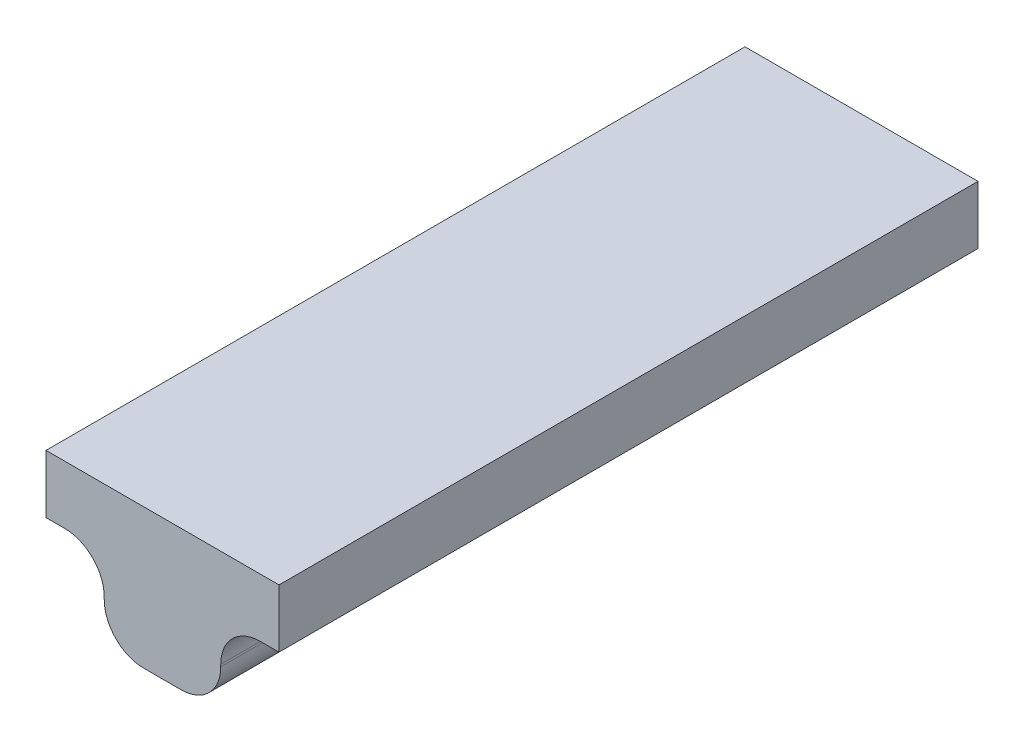
ISO-10303-21;
HEADER;
FILE_DESCRIPTION(('STEP AP214'),'2;1');
FILE_NAME('part.step','',(''),(''),'','','');
FILE_SCHEMA(('AUTOMOTIVE_DESIGN { 1 0 10303 214 1 1 1 1 }'));
ENDSEC;
DATA;
#1=APPLICATION_CONTEXT('core data for automotive mechanical design processes');
#2=APPLICATION_PROTOCOL_DEFINITION('international standard','automotive_design',2000,#1);
#3=PRODUCT_CONTEXT('',#1,'mechanical');
#4=PRODUCT('Part','Part','',(#3));
#5=PRODUCT_RELATED_PRODUCT_CATEGORY('part','',(#4));
#6=PRODUCT_DEFINITION_FORMATION('','',#4);
#7=PRODUCT_DEFINITION_CONTEXT('part definition',#1,'design');
#8=PRODUCT_DEFINITION('design','',#6,#7);
#9=PRODUCT_DEFINITION_SHAPE('','',#8);
#10=(LENGTH_UNIT() NAMED_UNIT(*) SI_UNIT(.MILLI.,.METRE.));
#11=(NAMED_UNIT(*) PLANE_ANGLE_UNIT() SI_UNIT($,.RADIAN.));
#12=(NAMED_UNIT(*) SI_UNIT($,.STERADIAN.) SOLID_ANGLE_UNIT());
#13=UNCERTAINTY_MEASURE_WITH_UNIT(LENGTH_MEASURE(1.E-05),#10,'distance_accuracy_value','');
#14=(GEOMETRIC_REPRESENTATION_CONTEXT(3) GLOBAL_UNCERTAINTY_ASSIGNED_CONTEXT((#13)) GLOBAL_UNIT_ASSIGNED_CONTEXT((#10,
#11,#12)) REPRESENTATION_CONTEXT('',''));
#15=CARTESIAN_POINT('',(0.,0.,0.));
#16=DIRECTION('',(0.,0.,1.));
#17=DIRECTION('',(1.,0.,0.));
#18=AXIS2_PLACEMENT_3D('',#15,#16,#17);
#19=CARTESIAN_POINT('',(-1.,0.,6.));
#20=DIRECTION('',(1.,0.,0.));
#21=DIRECTION('',(0.,0.,-1.));
#22=AXIS2_PLACEMENT_3D('',#19,#20,#21);
#23=PLANE('',#22);
#24=DIRECTION('',(0.,-1.,0.));
#25=VECTOR('',#24,1.);
#26=CARTESIAN_POINT('',(-1.,0.,0.));
#27=LINE('',#26,#25);
#28=CARTESIAN_POINT('',(-1.,0.,0.));
#29=VERTEX_POINT('',#28);
#30=CARTESIAN_POINT('',(-1.,-0.500000000000001,0.));
#31=VERTEX_POINT('',#30);
#32=EDGE_CURVE('E158',#29,#31,#27,.T.);
#33=ORIENTED_EDGE('',*,*,#32,.T.);
#34=DIRECTION('',(0.,0.,-1.));
#35=VECTOR('',#34,1.);
#36=CARTESIAN_POINT('',(-1.,-0.500000000000001,6.));
#37=LINE('',#36,#35);
#38=CARTESIAN_POINT('',(-1.,-0.500000000000001,6.));
#39=VERTEX_POINT('',#38);
#40=EDGE_CURVE('E11',#39,#31,#37,.T.);
#41=ORIENTED_EDGE('',*,*,#40,.F.);
#42=DIRECTION('',(0.,-1.,0.));
#43=VECTOR('',#42,1.);
#44=CARTESIAN_POINT('',(-1.,0.,6.));
#45=LINE('',#44,#43);
#46=CARTESIAN_POINT('',(-1.,0.,6.));
#47=VERTEX_POINT('',#46);
#48=EDGE_CURVE('E180',#47,#39,#45,.T.);
#49=ORIENTED_EDGE('',*,*,#48,.F.);
#50=DIRECTION('',(0.,0.,-1.));
#51=VECTOR('',#50,1.);
#52=CARTESIAN_POINT('',(-1.,0.,6.));
#53=LINE('',#52,#51);
#54=EDGE_CURVE('E154',#47,#29,#53,.T.);
#55=ORIENTED_EDGE('',*,*,#54,.T.);
#56=EDGE_LOOP('',(#33,#41,#49,#55));
#57=FACE_BOUND('',#56,.T.);
#58=ADVANCED_FACE('F38',(#57),#23,.F.);
#59=CARTESIAN_POINT('',(-1.,-0.500000000000001,6.));
#60=DIRECTION('',(0.,1.,0.));
#61=DIRECTION('',(0.,0.,1.));
#62=AXIS2_PLACEMENT_3D('',#59,#60,#61);
#63=PLANE('',#62);
#64=DIRECTION('',(1.,0.,0.));
#65=VECTOR('',#64,1.);
#66=CARTESIAN_POINT('',(-1.,-0.500000000000001,0.));
#67=LINE('',#66,#65);
#68=CARTESIAN_POINT('',(-0.840000000000001,-0.500000000000001,0.));
#69=VERTEX_POINT('',#68);
#70=EDGE_CURVE('E161',#31,#69,#67,.T.);
#71=ORIENTED_EDGE('',*,*,#70,.T.);
#72=DIRECTION('',(0.,0.,-1.));
#73=VECTOR('',#72,1.);
#74=CARTESIAN_POINT('',(-0.840000000000001,-0.500000000000001,6.));
#75=LINE('',#74,#73);
#76=CARTESIAN_POINT('',(-0.840000000000001,-0.500000000000001,6.));
#77=VERTEX_POINT('',#76);
#78=EDGE_CURVE('E46',#77,#69,#75,.T.);
#79=ORIENTED_EDGE('',*,*,#78,.F.);
#80=DIRECTION('',(1.,0.,0.));
#81=VECTOR('',#80,1.);
#82=CARTESIAN_POINT('',(-1.,-0.500000000000001,6.));
#83=LINE('',#82,#81);
#84=EDGE_CURVE('E109',#39,#77,#83,.T.);
#85=ORIENTED_EDGE('',*,*,#84,.F.);
#86=ORIENTED_EDGE('',*,*,#40,.T.);
#87=EDGE_LOOP('',(#71,#79,#85,#86));
#88=FACE_BOUND('',#87,.T.);
#89=ADVANCED_FACE('F258',(#88),#63,.F.);
#90=CARTESIAN_POINT('',(-0.840000000000001,-0.840000000000001,6.));
#91=DIRECTION('',(0.,0.,-1.));
#92=DIRECTION('',(-1.,0.,0.));
#93=AXIS2_PLACEMENT_3D('',#90,#91,#92);
#94=CYLINDRICAL_SURFACE('',#93,0.34);
#95=CARTESIAN_POINT('',(-0.840000000000001,-0.840000000000001,0.));
#96=DIRECTION('',(0.,0.,-1.));
#97=DIRECTION('',(-1.,0.,0.));
#98=AXIS2_PLACEMENT_3D('',#95,#96,#97);
#99=CIRCLE('',#98,0.34);
#100=CARTESIAN_POINT('',(-0.500000000000001,-0.840000000000001,0.));
#101=VERTEX_POINT('',#100);
#102=EDGE_CURVE('E163',#69,#101,#99,.T.);
#103=ORIENTED_EDGE('',*,*,#102,.T.);
#104=DIRECTION('',(0.,0.,-1.));
#105=VECTOR('',#104,1.);
#106=CARTESIAN_POINT('',(-0.500000000000001,-0.840000000000001,6.));
#107=LINE('',#106,#105);
#108=CARTESIAN_POINT('',(-0.500000000000001,-0.840000000000001,6.));
#109=VERTEX_POINT('',#108);
#110=EDGE_CURVE('E199',#109,#101,#107,.T.);
#111=ORIENTED_EDGE('',*,*,#110,.F.);
#112=CARTESIAN_POINT('',(-0.840000000000001,-0.840000000000001,6.));
#113=DIRECTION('',(0.,0.,-1.));
#114=DIRECTION('',(-1.,0.,0.));
#115=AXIS2_PLACEMENT_3D('',#112,#113,#114);
#116=CIRCLE('',#115,0.34);
#117=EDGE_CURVE('E207',#77,#109,#116,.T.);
#118=ORIENTED_EDGE('',*,*,#117,.F.);
#119=ORIENTED_EDGE('',*,*,#78,.T.);
#120=EDGE_LOOP('',(#103,#111,#118,#119));
#121=FACE_BOUND('',#120,.T.);
#122=ADVANCED_FACE('F205',(#121),#94,.F.);
#123=CARTESIAN_POINT('',(-0.500000000000001,-0.840000000000001,6.));
#124=DIRECTION('',(1.,0.,0.));
#125=DIRECTION('',(0.,0.,-1.));
#126=AXIS2_PLACEMENT_3D('',#123,#124,#125);
#127=PLANE('',#126);
#128=DIRECTION('',(0.,-1.,0.));
#129=VECTOR('',#128,1.);
#130=CARTESIAN_POINT('',(-0.500000000000001,-0.840000000000001,0.));
#131=LINE('',#130,#129);
#132=CARTESIAN_POINT('',(-0.500000000000001,-0.860000000000001,0.));
#133=VERTEX_POINT('',#132);
#134=EDGE_CURVE('E165',#101,#133,#131,.T.);
#135=ORIENTED_EDGE('',*,*,#134,.T.);
#136=DIRECTION('',(0.,0.,-1.));
#137=VECTOR('',#136,1.);
#138=CARTESIAN_POINT('',(-0.500000000000001,-0.860000000000001,6.));
#139=LINE('',#138,#137);
#140=CARTESIAN_POINT('',(-0.500000000000001,-0.860000000000001,6.));
#141=VERTEX_POINT('',#140);
#142=EDGE_CURVE('E196',#141,#133,#139,.T.);
#143=ORIENTED_EDGE('',*,*,#142,.F.);
#144=DIRECTION('',(0.,-1.,0.));
#145=VECTOR('',#144,1.);
#146=CARTESIAN_POINT('',(-0.500000000000001,-0.840000000000001,6.));
#147=LINE('',#146,#145);
#148=EDGE_CURVE('E225',#109,#141,#147,.T.);
#149=ORIENTED_EDGE('',*,*,#148,.F.);
#150=ORIENTED_EDGE('',*,*,#110,.T.);
#151=EDGE_LOOP('',(#135,#143,#149,#150));
#152=FACE_BOUND('',#151,.T.);
#153=ADVANCED_FACE('F216',(#152),#127,.F.);
#154=CARTESIAN_POINT('',(-0.160000000000001,-0.860000000000001,6.));
#155=DIRECTION('',(0.,0.,-1.));
#156=DIRECTION('',(-1.,0.,0.));
#157=AXIS2_PLACEMENT_3D('',#154,#155,#156);
#158=CYLINDRICAL_SURFACE('',#157,0.34);
#159=CARTESIAN_POINT('',(-0.160000000000001,-0.860000000000001,0.));
#160=DIRECTION('',(0.,0.,1.));
#161=DIRECTION('',(1.,0.,0.));
#162=AXIS2_PLACEMENT_3D('',#159,#160,#161);
#163=CIRCLE('',#162,0.34);
#164=CARTESIAN_POINT('',(-0.16,-1.2,0.));
#165=VERTEX_POINT('',#164);
#166=EDGE_CURVE('E167',#133,#165,#163,.T.);
#167=ORIENTED_EDGE('',*,*,#166,.T.);
#168=DIRECTION('',(0.,0.,-1.));
#169=VECTOR('',#168,1.);
#170=CARTESIAN_POINT('',(-0.16,-1.2,6.));
#171=LINE('',#170,#169);
#172=CARTESIAN_POINT('',(-0.16,-1.2,6.));
#173=VERTEX_POINT('',#172);
#174=EDGE_CURVE('E193',#173,#165,#171,.T.);
#175=ORIENTED_EDGE('',*,*,#174,.F.);
#176=CARTESIAN_POINT('',(-0.160000000000001,-0.860000000000001,6.));
#177=DIRECTION('',(0.,0.,1.));
#178=DIRECTION('',(1.,0.,0.));
#179=AXIS2_PLACEMENT_3D('',#176,#177,#178);
#180=CIRCLE('',#179,0.34);
#181=EDGE_CURVE('E222',#141,#173,#180,.T.);
#182=ORIENTED_EDGE('',*,*,#181,.F.);
#183=ORIENTED_EDGE('',*,*,#142,.T.);
#184=EDGE_LOOP('',(#167,#175,#182,#183));
#185=FACE_BOUND('',#184,.T.);
#186=ADVANCED_FACE('F220',(#185),#158,.T.);
#187=CARTESIAN_POINT('',(-0.16,-1.2,6.));
#188=DIRECTION('',(0.,1.,0.));
#189=DIRECTION('',(-1.,0.,0.));
#190=AXIS2_PLACEMENT_3D('',#187,#188,#189);
#191=PLANE('',#190);
#192=DIRECTION('',(1.,0.,0.));
#193=VECTOR('',#192,1.);
#194=CARTESIAN_POINT('',(-0.16,-1.2,0.));
#195=LINE('',#194,#193);
#196=CARTESIAN_POINT('',(0.159999999999999,-1.2,0.));
#197=VERTEX_POINT('',#196);
#198=EDGE_CURVE('E169',#165,#197,#195,.T.);
#199=ORIENTED_EDGE('',*,*,#198,.T.);
#200=DIRECTION('',(0.,0.,-1.));
#201=VECTOR('',#200,1.);
#202=CARTESIAN_POINT('',(0.159999999999999,-1.2,6.));
#203=LINE('',#202,#201);
#204=CARTESIAN_POINT('',(0.159999999999999,-1.2,6.));
#205=VERTEX_POINT('',#204);
#206=EDGE_CURVE('E190',#205,#197,#203,.T.);
#207=ORIENTED_EDGE('',*,*,#206,.F.);
#208=DIRECTION('',(1.,0.,0.));
#209=VECTOR('',#208,1.);
#210=CARTESIAN_POINT('',(-0.16,-1.2,6.));
#211=LINE('',#210,#209);
#212=EDGE_CURVE('E224',#173,#205,#211,.T.);
#213=ORIENTED_EDGE('',*,*,#212,.F.);
#214=ORIENTED_EDGE('',*,*,#174,.T.);
#215=EDGE_LOOP('',(#199,#207,#213,#214));
#216=FACE_BOUND('',#215,.T.);
#217=ADVANCED_FACE('F271',(#216),#191,.F.);
#218=CARTESIAN_POINT('',(0.159999999999999,-0.86,6.));
#219=DIRECTION('',(0.,0.,-1.));
#220=DIRECTION('',(-1.,0.,0.));
#221=AXIS2_PLACEMENT_3D('',#218,#219,#220);
#222=CYLINDRICAL_SURFACE('',#221,0.34);
#223=CARTESIAN_POINT('',(0.159999999999999,-0.86,0.));
#224=DIRECTION('',(0.,0.,1.));
#225=DIRECTION('',(1.,0.,0.));
#226=AXIS2_PLACEMENT_3D('',#223,#224,#225);
#227=CIRCLE('',#226,0.34);
#228=CARTESIAN_POINT('',(0.499999999999999,-0.86,0.));
#229=VERTEX_POINT('',#228);
#230=EDGE_CURVE('E171',#197,#229,#227,.T.);
#231=ORIENTED_EDGE('',*,*,#230,.T.);
#232=DIRECTION('',(0.,0.,-1.));
#233=VECTOR('',#232,1.);
#234=CARTESIAN_POINT('',(0.499999999999999,-0.86,6.));
#235=LINE('',#234,#233);
#236=CARTESIAN_POINT('',(0.499999999999999,-0.86,6.));
#237=VERTEX_POINT('',#236);
#238=EDGE_CURVE('E187',#237,#229,#235,.T.);
#239=ORIENTED_EDGE('',*,*,#238,.F.);
#240=CARTESIAN_POINT('',(0.159999999999999,-0.86,6.));
#241=DIRECTION('',(0.,0.,1.));
#242=DIRECTION('',(1.,0.,0.));
#243=AXIS2_PLACEMENT_3D('',#240,#241,#242);
#244=CIRCLE('',#243,0.34);
#245=EDGE_CURVE('E227',#205,#237,#244,.T.);
#246=ORIENTED_EDGE('',*,*,#245,.F.);
#247=ORIENTED_EDGE('',*,*,#206,.T.);
#248=EDGE_LOOP('',(#231,#239,#246,#247));
#249=FACE_BOUND('',#248,.T.);
#250=ADVANCED_FACE('F274',(#249),#222,.T.);
#251=CARTESIAN_POINT('',(0.499999999999999,-0.840000000000001,6.));
#252=DIRECTION('',(-1.,0.,0.));
#253=DIRECTION('',(0.,0.,1.));
#254=AXIS2_PLACEMENT_3D('',#251,#252,#253);
#255=PLANE('',#254);
#256=DIRECTION('',(0.,1.,0.));
#257=VECTOR('',#256,1.);
#258=CARTESIAN_POINT('',(0.499999999999999,-0.840000000000001,0.));
#259=LINE('',#258,#257);
#260=CARTESIAN_POINT('',(0.499999999999999,-0.840000000000001,0.));
#261=VERTEX_POINT('',#260);
#262=EDGE_CURVE('E173',#229,#261,#259,.T.);
#263=ORIENTED_EDGE('',*,*,#262,.T.);
#264=DIRECTION('',(0.,0.,-1.));
#265=VECTOR('',#264,1.);
#266=CARTESIAN_POINT('',(0.499999999999999,-0.840000000000001,6.));
#267=LINE('',#266,#265);
#268=CARTESIAN_POINT('',(0.499999999999999,-0.840000000000001,6.));
#269=VERTEX_POINT('',#268);
#270=EDGE_CURVE('E184',#269,#261,#267,.T.);
#271=ORIENTED_EDGE('',*,*,#270,.F.);
#272=DIRECTION('',(0.,1.,0.));
#273=VECTOR('',#272,1.);
#274=CARTESIAN_POINT('',(0.499999999999999,-0.840000000000001,6.));
#275=LINE('',#274,#273);
#276=EDGE_CURVE('E233',#237,#269,#275,.T.);
#277=ORIENTED_EDGE('',*,*,#276,.F.);
#278=ORIENTED_EDGE('',*,*,#238,.T.);
#279=EDGE_LOOP('',(#263,#271,#277,#278));
#280=FACE_BOUND('',#279,.T.);
#281=ADVANCED_FACE('F239',(#280),#255,.F.);
#282=CARTESIAN_POINT('',(0.84,-0.840000000000001,6.));
#283=DIRECTION('',(0.,0.,-1.));
#284=DIRECTION('',(-1.,0.,0.));
#285=AXIS2_PLACEMENT_3D('',#282,#283,#284);
#286=CYLINDRICAL_SURFACE('',#285,0.34);
#287=CARTESIAN_POINT('',(0.84,-0.840000000000001,0.));
#288=DIRECTION('',(0.,0.,-1.));
#289=DIRECTION('',(1.,0.,0.));
#290=AXIS2_PLACEMENT_3D('',#287,#288,#289);
#291=CIRCLE('',#290,0.34);
#292=CARTESIAN_POINT('',(0.839999999999999,-0.500000000000001,0.));
#293=VERTEX_POINT('',#292);
#294=EDGE_CURVE('E175',#261,#293,#291,.T.);
#295=ORIENTED_EDGE('',*,*,#294,.T.);
#296=DIRECTION('',(0.,0.,-1.));
#297=VECTOR('',#296,1.);
#298=CARTESIAN_POINT('',(0.839999999999999,-0.500000000000001,6.));
#299=LINE('',#298,#297);
#300=CARTESIAN_POINT('',(0.839999999999999,-0.500000000000001,6.));
#301=VERTEX_POINT('',#300);
#302=EDGE_CURVE('E149',#301,#293,#299,.T.);
#303=ORIENTED_EDGE('',*,*,#302,.F.);
#304=CARTESIAN_POINT('',(0.84,-0.840000000000001,6.));
#305=DIRECTION('',(0.,0.,-1.));
#306=DIRECTION('',(1.,0.,0.));
#307=AXIS2_PLACEMENT_3D('',#304,#305,#306);
#308=CIRCLE('',#307,0.34);
#309=EDGE_CURVE('E140',#269,#301,#308,.T.);
#310=ORIENTED_EDGE('',*,*,#309,.F.);
#311=ORIENTED_EDGE('',*,*,#270,.T.);
#312=EDGE_LOOP('',(#295,#303,#310,#311));
#313=FACE_BOUND('',#312,.T.);
#314=ADVANCED_FACE('F243',(#313),#286,.F.);
#315=CARTESIAN_POINT('',(0.839999999999999,-0.500000000000001,6.));
#316=DIRECTION('',(0.,1.,0.));
#317=DIRECTION('',(-1.,0.,0.));
#318=AXIS2_PLACEMENT_3D('',#315,#316,#317);
#319=PLANE('',#318);
#320=DIRECTION('',(1.,0.,0.));
#321=VECTOR('',#320,1.);
#322=CARTESIAN_POINT('',(0.839999999999999,-0.500000000000001,0.));
#323=LINE('',#322,#321);
#324=CARTESIAN_POINT('',(0.999999999999999,-0.5,0.));
#325=VERTEX_POINT('',#324);
#326=EDGE_CURVE('E148',#293,#325,#323,.T.);
#327=ORIENTED_EDGE('',*,*,#326,.T.);
#328=DIRECTION('',(0.,0.,-1.));
#329=VECTOR('',#328,1.);
#330=CARTESIAN_POINT('',(0.999999999999999,-0.5,6.));
#331=LINE('',#330,#329);
#332=CARTESIAN_POINT('',(0.999999999999999,-0.5,6.));
#333=VERTEX_POINT('',#332);
#334=EDGE_CURVE('E145',#333,#325,#331,.T.);
#335=ORIENTED_EDGE('',*,*,#334,.F.);
#336=DIRECTION('',(1.,0.,0.));
#337=VECTOR('',#336,1.);
#338=CARTESIAN_POINT('',(0.839999999999999,-0.500000000000001,6.));
#339=LINE('',#338,#337);
#340=EDGE_CURVE('E134',#301,#333,#339,.T.);
#341=ORIENTED_EDGE('',*,*,#340,.F.);
#342=ORIENTED_EDGE('',*,*,#302,.T.);
#343=EDGE_LOOP('',(#327,#335,#341,#342));
#344=FACE_BOUND('',#343,.T.);
#345=ADVANCED_FACE('F146',(#344),#319,.F.);
#346=CARTESIAN_POINT('',(0.999999999999999,0.,6.));
#347=DIRECTION('',(-1.,0.,0.));
#348=DIRECTION('',(0.,0.,1.));
#349=AXIS2_PLACEMENT_3D('',#346,#347,#348);
#350=PLANE('',#349);
#351=DIRECTION('',(0.,1.,0.));
#352=VECTOR('',#351,1.);
#353=CARTESIAN_POINT('',(0.999999999999999,0.,0.));
#354=LINE('',#353,#352);
#355=CARTESIAN_POINT('',(0.999999999999999,0.,0.));
#356=VERTEX_POINT('',#355);
#357=EDGE_CURVE('E95',#325,#356,#354,.T.);
#358=ORIENTED_EDGE('',*,*,#357,.T.);
#359=DIRECTION('',(0.,0.,-1.));
#360=VECTOR('',#359,1.);
#361=CARTESIAN_POINT('',(0.999999999999999,0.,6.));
#362=LINE('',#361,#360);
#363=CARTESIAN_POINT('',(0.999999999999999,0.,6.));
#364=VERTEX_POINT('',#363);
#365=EDGE_CURVE('E150',#364,#356,#362,.T.);
#366=ORIENTED_EDGE('',*,*,#365,.F.);
#367=DIRECTION('',(0.,1.,0.));
#368=VECTOR('',#367,1.);
#369=CARTESIAN_POINT('',(0.999999999999999,0.,6.));
#370=LINE('',#369,#368);
#371=EDGE_CURVE('E138',#333,#364,#370,.T.);
#372=ORIENTED_EDGE('',*,*,#371,.F.);
#373=ORIENTED_EDGE('',*,*,#334,.T.);
#374=EDGE_LOOP('',(#358,#366,#372,#373));
#375=FACE_BOUND('',#374,.T.);
#376=ADVANCED_FACE('F152',(#375),#350,.F.);
#377=CARTESIAN_POINT('',(-1.,0.,6.));
#378=DIRECTION('',(0.,-1.,0.));
#379=DIRECTION('',(1.,0.,0.));
#380=AXIS2_PLACEMENT_3D('',#377,#378,#379);
#381=PLANE('',#380);
#382=DIRECTION('',(-1.,0.,0.));
#383=VECTOR('',#382,1.);
#384=CARTESIAN_POINT('',(-1.,0.,0.));
#385=LINE('',#384,#383);
#386=EDGE_CURVE('E101',#356,#29,#385,.T.);
#387=ORIENTED_EDGE('',*,*,#386,.T.);
#388=ORIENTED_EDGE('',*,*,#54,.F.);
#389=DIRECTION('',(-1.,0.,0.));
#390=VECTOR('',#389,1.);
#391=CARTESIAN_POINT('',(-1.,0.,6.));
#392=LINE('',#391,#390);
#393=EDGE_CURVE('E54',#364,#47,#392,.T.);
#394=ORIENTED_EDGE('',*,*,#393,.F.);
#395=ORIENTED_EDGE('',*,*,#365,.T.);
#396=EDGE_LOOP('',(#387,#388,#394,#395));
#397=FACE_BOUND('',#396,.T.);
#398=ADVANCED_FACE('F247',(#397),#381,.F.);
#399=CARTESIAN_POINT('',(-0.840000000000001,-0.840000000000001,6.));
#400=DIRECTION('',(0.,0.,-1.));
#401=DIRECTION('',(-1.,0.,0.));
#402=AXIS2_PLACEMENT_3D('',#399,#400,#401);
#403=PLANE('',#402);
#404=ORIENTED_EDGE('',*,*,#48,.T.);
#405=ORIENTED_EDGE('',*,*,#84,.T.);
#406=ORIENTED_EDGE('',*,*,#117,.T.);
#407=ORIENTED_EDGE('',*,*,#148,.T.);
#408=ORIENTED_EDGE('',*,*,#181,.T.);
#409=ORIENTED_EDGE('',*,*,#212,.T.);
#410=ORIENTED_EDGE('',*,*,#245,.T.);
#411=ORIENTED_EDGE('',*,*,#276,.T.);
#412=ORIENTED_EDGE('',*,*,#309,.T.);
#413=ORIENTED_EDGE('',*,*,#340,.T.);
#414=ORIENTED_EDGE('',*,*,#371,.T.);
#415=ORIENTED_EDGE('',*,*,#393,.T.);
#416=EDGE_LOOP('',(#404,#405,#406,#407,#408,#409,#410,#411,#412,#413,#414,#415));
#417=FACE_BOUND('',#416,.T.);
#418=ADVANCED_FACE('F136',(#417),#403,.F.);
#419=CARTESIAN_POINT('',(-0.840000000000001,-0.840000000000001,0.));
#420=DIRECTION('',(0.,0.,-1.));
#421=DIRECTION('',(-1.,0.,0.));
#422=AXIS2_PLACEMENT_3D('',#419,#420,#421);
#423=PLANE('',#422);
#424=ORIENTED_EDGE('',*,*,#32,.F.);
#425=ORIENTED_EDGE('',*,*,#386,.F.);
#426=ORIENTED_EDGE('',*,*,#357,.F.);
#427=ORIENTED_EDGE('',*,*,#326,.F.);
#428=ORIENTED_EDGE('',*,*,#294,.F.);
#429=ORIENTED_EDGE('',*,*,#262,.F.);
#430=ORIENTED_EDGE('',*,*,#230,.F.);
#431=ORIENTED_EDGE('',*,*,#198,.F.);
#432=ORIENTED_EDGE('',*,*,#166,.F.);
#433=ORIENTED_EDGE('',*,*,#134,.F.);
#434=ORIENTED_EDGE('',*,*,#102,.F.);
#435=ORIENTED_EDGE('',*,*,#70,.F.);
#436=EDGE_LOOP('',(#424,#425,#426,#427,#428,#429,#430,#431,#432,#433,#434,#435));
#437=FACE_BOUND('',#436,.T.);
#438=ADVANCED_FACE('F211',(#437),#423,.T.);
#439=CLOSED_SHELL('',(#58,#89,#122,#153,#186,#217,#250,#281,#314,#345,#376,#398,#418,#438));
#440=MANIFOLD_SOLID_BREP('B2',#439);
#441=ADVANCED_BREP_SHAPE_REPRESENTATION('',(#18,#440),#14);
#442=SHAPE_DEFINITION_REPRESENTATION(#9,#441);
ENDSEC;
END-ISO-10303-21;
